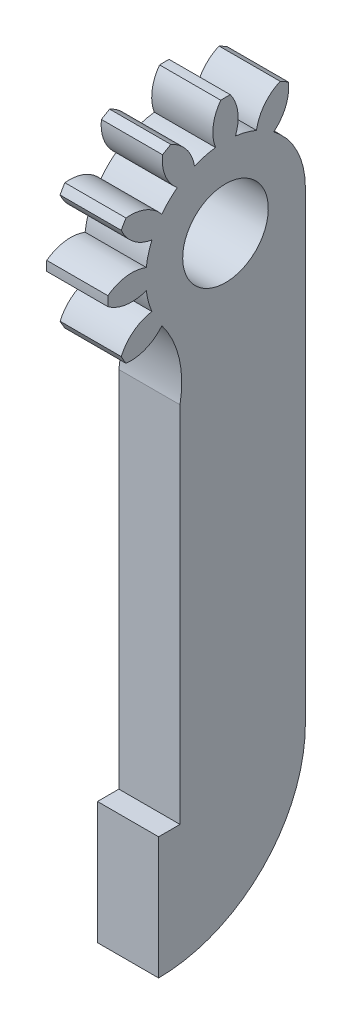
ISO-10303-21;
HEADER;
FILE_DESCRIPTION(('STEP AP214'),'2;1');
FILE_NAME('part.step','',(''),(''),'','','');
FILE_SCHEMA(('AUTOMOTIVE_DESIGN { 1 0 10303 214 1 1 1 1 }'));
ENDSEC;
DATA;
#1=APPLICATION_CONTEXT('core data for automotive mechanical design processes');
#2=APPLICATION_PROTOCOL_DEFINITION('international standard','automotive_design',2000,#1);
#3=PRODUCT_CONTEXT('',#1,'mechanical');
#4=PRODUCT('Part','Part','',(#3));
#5=PRODUCT_RELATED_PRODUCT_CATEGORY('part','',(#4));
#6=PRODUCT_DEFINITION_FORMATION('','',#4);
#7=PRODUCT_DEFINITION_CONTEXT('part definition',#1,'design');
#8=PRODUCT_DEFINITION('design','',#6,#7);
#9=PRODUCT_DEFINITION_SHAPE('','',#8);
#10=(LENGTH_UNIT() NAMED_UNIT(*) SI_UNIT(.MILLI.,.METRE.));
#11=(NAMED_UNIT(*) PLANE_ANGLE_UNIT() SI_UNIT($,.RADIAN.));
#12=(NAMED_UNIT(*) SI_UNIT($,.STERADIAN.) SOLID_ANGLE_UNIT());
#13=UNCERTAINTY_MEASURE_WITH_UNIT(LENGTH_MEASURE(1.E-05),#10,'distance_accuracy_value','');
#14=(GEOMETRIC_REPRESENTATION_CONTEXT(3) GLOBAL_UNCERTAINTY_ASSIGNED_CONTEXT((#13)) GLOBAL_UNIT_ASSIGNED_CONTEXT((#10,
#11,#12)) REPRESENTATION_CONTEXT('',''));
#15=CARTESIAN_POINT('',(0.,0.,0.));
#16=DIRECTION('',(0.,0.,1.));
#17=DIRECTION('',(1.,0.,0.));
#18=AXIS2_PLACEMENT_3D('',#15,#16,#17);
#19=CARTESIAN_POINT('',(5.,0.,0.));
#20=DIRECTION('',(-1.,0.,0.));
#21=DIRECTION('',(0.,-0.258819045102521,0.965925826289068));
#22=AXIS2_PLACEMENT_3D('',#19,#20,#21);
#23=PLANE('',#22);
#24=CARTESIAN_POINT('',(5.,0.,0.));
#25=DIRECTION('',(-1.,0.,0.));
#26=DIRECTION('',(0.,-0.258819045102521,0.965925826289068));
#27=AXIS2_PLACEMENT_3D('',#24,#25,#26);
#28=CIRCLE('',#27,3.5);
#29=CARTESIAN_POINT('',(5.,-0.905866657858825,3.38074039201174));
#30=VERTEX_POINT('',#29);
#31=EDGE_CURVE('E279',#30,#30,#28,.F.);
#32=ORIENTED_EDGE('',*,*,#31,.F.);
#33=EDGE_LOOP('',(#32));
#34=FACE_BOUND('',#33,.T.);
#35=CARTESIAN_POINT('',(5.,-1.86722961459193,7.76589373379012));
#36=DIRECTION('',(-1.,0.,0.));
#37=DIRECTION('',(0.,0.707106781186544,0.707106781186551));
#38=AXIS2_PLACEMENT_3D('',#35,#36,#37);
#39=CIRCLE('',#38,3.3);
#40=CARTESIAN_POINT('',(5.,-3.94616087558726,5.20307403430745));
#41=VERTEX_POINT('',#40);
#42=CARTESIAN_POINT('',(5.,-5.14670283362109,8.1333925850408));
#43=VERTEX_POINT('',#42);
#44=EDGE_CURVE('E323',#41,#43,#39,.T.);
#45=ORIENTED_EDGE('',*,*,#44,.F.);
#46=CARTESIAN_POINT('',(5.,-8.78047610160434,11.5771932907616));
#47=DIRECTION('',(-1.,0.,0.));
#48=DIRECTION('',(0.,0.,1.));
#49=AXIS2_PLACEMENT_3D('',#46,#47,#48);
#50=CIRCLE('',#49,8.);
#51=CARTESIAN_POINT('',(5.,-10.2840002724994,3.71975));
#52=VERTEX_POINT('',#51);
#53=EDGE_CURVE('E256',#41,#52,#50,.T.);
#54=ORIENTED_EDGE('',*,*,#53,.T.);
#55=DIRECTION('',(0.,-1.,0.));
#56=VECTOR('',#55,1.);
#57=CARTESIAN_POINT('',(5.,-40.,3.71975));
#58=LINE('',#57,#56);
#59=CARTESIAN_POINT('',(5.,-40.,3.71975));
#60=VERTEX_POINT('',#59);
#61=EDGE_CURVE('E765',#52,#60,#58,.T.);
#62=ORIENTED_EDGE('',*,*,#61,.T.);
#63=DIRECTION('',(0.,0.,1.));
#64=VECTOR('',#63,1.);
#65=CARTESIAN_POINT('',(5.,-40.,5.46975));
#66=LINE('',#65,#64);
#67=CARTESIAN_POINT('',(5.,-40.,5.46975));
#68=VERTEX_POINT('',#67);
#69=EDGE_CURVE('E754',#60,#68,#66,.T.);
#70=ORIENTED_EDGE('',*,*,#69,.T.);
#71=DIRECTION('',(0.,-1.,0.));
#72=VECTOR('',#71,1.);
#73=CARTESIAN_POINT('',(5.,-50.,5.46975));
#74=LINE('',#73,#72);
#75=CARTESIAN_POINT('',(5.,-50.,5.46975));
#76=VERTEX_POINT('',#75);
#77=EDGE_CURVE('E751',#68,#76,#74,.T.);
#78=ORIENTED_EDGE('',*,*,#77,.T.);
#79=CARTESIAN_POINT('',(5.,-38.,5.46975));
#80=DIRECTION('',(-1.,0.,0.));
#81=DIRECTION('',(0.,0.,1.));
#82=AXIS2_PLACEMENT_3D('',#79,#80,#81);
#83=CIRCLE('',#82,12.);
#84=CARTESIAN_POINT('',(5.,-38.,-6.53024999999999));
#85=VERTEX_POINT('',#84);
#86=EDGE_CURVE('E271',#76,#85,#83,.F.);
#87=ORIENTED_EDGE('',*,*,#86,.T.);
#88=DIRECTION('',(0.,1.,0.));
#89=VECTOR('',#88,1.);
#90=CARTESIAN_POINT('',(5.,0.,-6.53025));
#91=LINE('',#90,#89);
#92=CARTESIAN_POINT('',(5.,0.,-6.53025));
#93=VERTEX_POINT('',#92);
#94=EDGE_CURVE('E237',#85,#93,#91,.T.);
#95=ORIENTED_EDGE('',*,*,#94,.T.);
#96=CARTESIAN_POINT('',(5.,0.,0.));
#97=DIRECTION('',(-1.,0.,0.));
#98=DIRECTION('',(0.,-0.258819045102528,0.965925826289066));
#99=AXIS2_PLACEMENT_3D('',#96,#97,#98);
#100=CIRCLE('',#99,6.53025);
#101=CARTESIAN_POINT('',(5.,5.20307403430752,-3.94616087558717));
#102=VERTEX_POINT('',#101);
#103=EDGE_CURVE('E51',#102,#93,#100,.T.);
#104=ORIENTED_EDGE('',*,*,#103,.F.);
#105=CARTESIAN_POINT('',(5.,7.76589373379015,-1.8672296145918));
#106=DIRECTION('',(-1.,0.,0.));
#107=DIRECTION('',(0.,-0.707106781186539,-0.707106781186556));
#108=AXIS2_PLACEMENT_3D('',#105,#106,#107);
#109=CIRCLE('',#108,3.3);
#110=CARTESIAN_POINT('',(5.,8.13339258504089,-5.14670283362094));
#111=VERTEX_POINT('',#110);
#112=EDGE_CURVE('E345',#111,#102,#109,.T.);
#113=ORIENTED_EDGE('',*,*,#112,.F.);
#114=CARTESIAN_POINT('',(5.,0.,0.));
#115=DIRECTION('',(-1.,0.,0.));
#116=DIRECTION('',(0.,-0.258819045102521,0.965925826289068));
#117=AXIS2_PLACEMENT_3D('',#114,#115,#116);
#118=CIRCLE('',#117,9.625);
#119=CARTESIAN_POINT('',(5.,8.52387169216566,-4.47037318078671));
#120=VERTEX_POINT('',#119);
#121=EDGE_CURVE('E420',#120,#111,#118,.T.);
#122=ORIENTED_EDGE('',*,*,#121,.F.);
#123=CARTESIAN_POINT('',(5.,5.50001514783035,-5.79184644925662));
#124=DIRECTION('',(-1.,0.,0.));
#125=DIRECTION('',(0.,-0.258819045102508,-0.965925826289072));
#126=AXIS2_PLACEMENT_3D('',#123,#124,#125);
#127=CIRCLE('',#126,3.3);
#128=CARTESIAN_POINT('',(5.,6.01901258283256,-2.53291385368776));
#129=VERTEX_POINT('',#128);
#130=EDGE_CURVE('E329',#129,#120,#127,.T.);
#131=ORIENTED_EDGE('',*,*,#130,.F.);
#132=CARTESIAN_POINT('',(5.,0.,0.));
#133=DIRECTION('',(-1.,0.,0.));
#134=DIRECTION('',(0.,-0.258819045102508,-0.965925826289072));
#135=AXIS2_PLACEMENT_3D('',#132,#133,#134);
#136=CIRCLE('',#135,6.53025);
#137=CARTESIAN_POINT('',(5.,6.47907472927509,-0.81593854852496));
#138=VERTEX_POINT('',#137);
#139=EDGE_CURVE('E334',#138,#129,#136,.T.);
#140=ORIENTED_EDGE('',*,*,#139,.F.);
#141=CARTESIAN_POINT('',(5.,7.65907606384855,2.26587858595996));
#142=DIRECTION('',(-1.,0.,0.));
#143=DIRECTION('',(0.,-0.258819045102508,-0.965925826289072));
#144=AXIS2_PLACEMENT_3D('',#141,#142,#143);
#145=CIRCLE('',#144,3.3);
#146=CARTESIAN_POINT('',(5.,9.61707601440787,-0.390479107124634));
#147=VERTEX_POINT('',#146);
#148=EDGE_CURVE('E331',#147,#138,#145,.T.);
#149=ORIENTED_EDGE('',*,*,#148,.F.);
#150=CARTESIAN_POINT('',(5.,9.61707601440786,0.39047910712477));
#151=VERTEX_POINT('',#150);
#152=EDGE_CURVE('E416',#151,#147,#118,.T.);
#153=ORIENTED_EDGE('',*,*,#152,.F.);
#154=CARTESIAN_POINT('',(5.,7.65907606384858,-2.26587858595985));
#155=DIRECTION('',(-1.,0.,0.));
#156=DIRECTION('',(0.,0.258819045102521,-0.965925826289068));
#157=AXIS2_PLACEMENT_3D('',#154,#155,#156);
#158=CIRCLE('',#157,3.3);
#159=CARTESIAN_POINT('',(5.,6.47907472927507,0.815938548525052));
#160=VERTEX_POINT('',#159);
#161=EDGE_CURVE('E388',#160,#151,#158,.T.);
#162=ORIENTED_EDGE('',*,*,#161,.F.);
#163=CARTESIAN_POINT('',(5.,0.,0.));
#164=DIRECTION('',(-1.,0.,0.));
#165=DIRECTION('',(0.,0.258819045102521,-0.965925826289068));
#166=AXIS2_PLACEMENT_3D('',#163,#164,#165);
#167=CIRCLE('',#166,6.53025);
#168=CARTESIAN_POINT('',(5.,6.01901258283252,2.53291385368785));
#169=VERTEX_POINT('',#168);
#170=EDGE_CURVE('E393',#169,#160,#167,.T.);
#171=ORIENTED_EDGE('',*,*,#170,.F.);
#172=CARTESIAN_POINT('',(5.,5.50001514783026,5.79184644925669));
#173=DIRECTION('',(-1.,0.,0.));
#174=DIRECTION('',(0.,0.258819045102521,-0.965925826289068));
#175=AXIS2_PLACEMENT_3D('',#172,#173,#174);
#176=CIRCLE('',#175,3.3);
#177=CARTESIAN_POINT('',(5.,8.52387169216559,4.47037318078683));
#178=VERTEX_POINT('',#177);
#179=EDGE_CURVE('E390',#178,#169,#176,.T.);
#180=ORIENTED_EDGE('',*,*,#179,.F.);
#181=CARTESIAN_POINT('',(5.,8.13339258504082,5.14670283362106));
#182=VERTEX_POINT('',#181);
#183=EDGE_CURVE('E413',#182,#178,#118,.T.);
#184=ORIENTED_EDGE('',*,*,#183,.F.);
#185=CARTESIAN_POINT('',(5.,7.76589373379012,1.86722961459191));
#186=DIRECTION('',(-1.,0.,0.));
#187=DIRECTION('',(0.,0.707106781186549,-0.707106781186546));
#188=AXIS2_PLACEMENT_3D('',#185,#186,#187);
#189=CIRCLE('',#188,3.3);
#190=CARTESIAN_POINT('',(5.,5.20307403430747,3.94616087558724));
#191=VERTEX_POINT('',#190);
#192=EDGE_CURVE('E366',#191,#182,#189,.T.);
#193=ORIENTED_EDGE('',*,*,#192,.F.);
#194=CARTESIAN_POINT('',(5.,0.,0.));
#195=DIRECTION('',(-1.,0.,0.));
#196=DIRECTION('',(0.,0.707106781186549,-0.707106781186546));
#197=AXIS2_PLACEMENT_3D('',#194,#195,#196);
#198=CIRCLE('',#197,6.53025);
#199=CARTESIAN_POINT('',(5.,3.94616087558722,5.20307403430748));
#200=VERTEX_POINT('',#199);
#201=EDGE_CURVE('E371',#200,#191,#198,.T.);
#202=ORIENTED_EDGE('',*,*,#201,.F.);
#203=CARTESIAN_POINT('',(5.,1.86722961459188,7.76589373379013));
#204=DIRECTION('',(-1.,0.,0.));
#205=DIRECTION('',(0.,0.707106781186549,-0.707106781186546));
#206=AXIS2_PLACEMENT_3D('',#203,#204,#205);
#207=CIRCLE('',#206,3.3);
#208=CARTESIAN_POINT('',(5.,5.14670283362103,8.13339258504084));
#209=VERTEX_POINT('',#208);
#210=EDGE_CURVE('E368',#209,#200,#207,.T.);
#211=ORIENTED_EDGE('',*,*,#210,.F.);
#212=CARTESIAN_POINT('',(5.,4.4703731807868,8.52387169216561));
#213=VERTEX_POINT('',#212);
#214=EDGE_CURVE('E421',#213,#209,#118,.T.);
#215=ORIENTED_EDGE('',*,*,#214,.F.);
#216=CARTESIAN_POINT('',(5.,5.79184644925667,5.50001514783029));
#217=DIRECTION('',(-1.,0.,0.));
#218=DIRECTION('',(0.,0.965925826289069,-0.258819045102518));
#219=AXIS2_PLACEMENT_3D('',#216,#217,#218);
#220=CIRCLE('',#219,3.3);
#221=CARTESIAN_POINT('',(5.,2.53291385368783,6.01901258283253));
#222=VERTEX_POINT('',#221);
#223=EDGE_CURVE('E283',#222,#213,#220,.T.);
#224=ORIENTED_EDGE('',*,*,#223,.F.);
#225=CARTESIAN_POINT('',(5.,0.,0.));
#226=DIRECTION('',(-1.,0.,0.));
#227=DIRECTION('',(0.,0.965925826289069,-0.258819045102518));
#228=AXIS2_PLACEMENT_3D('',#225,#226,#227);
#229=CIRCLE('',#228,6.53025);
#230=CARTESIAN_POINT('',(5.,0.815938548525029,6.47907472927508));
#231=VERTEX_POINT('',#230);
#232=EDGE_CURVE('E288',#231,#222,#229,.T.);
#233=ORIENTED_EDGE('',*,*,#232,.F.);
#234=CARTESIAN_POINT('',(5.,-2.26587858595988,7.65907606384858));
#235=DIRECTION('',(-1.,0.,0.));
#236=DIRECTION('',(0.,0.965925826289069,-0.258819045102518));
#237=AXIS2_PLACEMENT_3D('',#234,#235,#236);
#238=CIRCLE('',#237,3.3);
#239=CARTESIAN_POINT('',(5.,0.390479107124735,9.61707601440787));
#240=VERTEX_POINT('',#239);
#241=EDGE_CURVE('E285',#240,#231,#238,.T.);
#242=ORIENTED_EDGE('',*,*,#241,.F.);
#243=CARTESIAN_POINT('',(5.,-0.390479107124802,9.61707601440786));
#244=VERTEX_POINT('',#243);
#245=EDGE_CURVE('E468',#244,#240,#118,.T.);
#246=ORIENTED_EDGE('',*,*,#245,.F.);
#247=CARTESIAN_POINT('',(5.,2.26587858595983,7.65907606384859));
#248=DIRECTION('',(-1.,0.,0.));
#249=DIRECTION('',(0.,0.965925826289067,0.258819045102525));
#250=AXIS2_PLACEMENT_3D('',#247,#248,#249);
#251=CIRCLE('',#250,3.3);
#252=CARTESIAN_POINT('',(5.,-0.815938548525075,6.47907472927507));
#253=VERTEX_POINT('',#252);
#254=EDGE_CURVE('E302',#253,#244,#251,.T.);
#255=ORIENTED_EDGE('',*,*,#254,.F.);
#256=CARTESIAN_POINT('',(5.,0.,0.));
#257=DIRECTION('',(-1.,0.,0.));
#258=DIRECTION('',(0.,0.965925826289067,0.258819045102525));
#259=AXIS2_PLACEMENT_3D('',#256,#257,#258);
#260=CIRCLE('',#259,6.53025);
#261=CARTESIAN_POINT('',(5.,-2.53291385368787,6.01901258283251));
#262=VERTEX_POINT('',#261);
#263=EDGE_CURVE('E307',#262,#253,#260,.T.);
#264=ORIENTED_EDGE('',*,*,#263,.F.);
#265=CARTESIAN_POINT('',(5.,-5.79184644925671,5.50001514783024));
#266=DIRECTION('',(-1.,0.,0.));
#267=DIRECTION('',(0.,0.965925826289067,0.258819045102525));
#268=AXIS2_PLACEMENT_3D('',#265,#266,#267);
#269=CIRCLE('',#268,3.3);
#270=CARTESIAN_POINT('',(5.,-4.47037318078686,8.52387169216557));
#271=VERTEX_POINT('',#270);
#272=EDGE_CURVE('E304',#271,#262,#269,.T.);
#273=ORIENTED_EDGE('',*,*,#272,.F.);
#274=EDGE_CURVE('E446',#43,#271,#118,.T.);
#275=ORIENTED_EDGE('',*,*,#274,.F.);
#276=EDGE_LOOP('',(#45,#54,#62,#70,#78,#87,#95,#104,#113,#122,#131,#140,#149,#153,#162,#171,
#180,#184,#193,#202,#211,#215,#224,#233,#242,#246,#255,#264,#273,#275));
#277=FACE_BOUND('',#276,.T.);
#278=ADVANCED_FACE('F36',(#34,#277),#23,.F.);
#279=CARTESIAN_POINT('',(-10.,0.,0.));
#280=DIRECTION('',(-1.,0.,0.));
#281=DIRECTION('',(0.,-0.258819045102521,0.965925826289068));
#282=AXIS2_PLACEMENT_3D('',#279,#280,#281);
#283=CYLINDRICAL_SURFACE('',#282,9.625);
#284=DIRECTION('',(-1.,0.,0.));
#285=VECTOR('',#284,1.);
#286=CARTESIAN_POINT('',(2.5,4.4703731807868,8.52387169216561));
#287=LINE('',#286,#285);
#288=CARTESIAN_POINT('',(0.,4.4703731807868,8.52387169216561));
#289=VERTEX_POINT('',#288);
#290=EDGE_CURVE('E363',#213,#289,#287,.T.);
#291=ORIENTED_EDGE('',*,*,#290,.F.);
#292=ORIENTED_EDGE('',*,*,#214,.T.);
#293=DIRECTION('',(-1.,0.,0.));
#294=VECTOR('',#293,1.);
#295=CARTESIAN_POINT('',(2.5,5.14670283362103,8.13339258504084));
#296=LINE('',#295,#294);
#297=CARTESIAN_POINT('',(0.,5.14670283362103,8.13339258504084));
#298=VERTEX_POINT('',#297);
#299=EDGE_CURVE('E382',#298,#209,#296,.F.);
#300=ORIENTED_EDGE('',*,*,#299,.F.);
#301=CARTESIAN_POINT('',(0.,0.,0.));
#302=DIRECTION('',(-1.,0.,0.));
#303=DIRECTION('',(0.,-0.258819045102521,0.965925826289068));
#304=AXIS2_PLACEMENT_3D('',#301,#302,#303);
#305=CIRCLE('',#304,9.625);
#306=EDGE_CURVE('E415',#289,#298,#305,.T.);
#307=ORIENTED_EDGE('',*,*,#306,.F.);
#308=EDGE_LOOP('',(#291,#292,#300,#307));
#309=FACE_BOUND('',#308,.T.);
#310=ADVANCED_FACE('F496',(#309),#283,.T.);
#311=DIRECTION('',(-1.,0.,0.));
#312=VECTOR('',#311,1.);
#313=CARTESIAN_POINT('',(2.5,0.390479107124735,9.61707601440787));
#314=LINE('',#313,#312);
#315=CARTESIAN_POINT('',(0.,0.390479107124735,9.61707601440787));
#316=VERTEX_POINT('',#315);
#317=EDGE_CURVE('E361',#316,#240,#314,.F.);
#318=ORIENTED_EDGE('',*,*,#317,.F.);
#319=CARTESIAN_POINT('',(0.,-0.390479107124802,9.61707601440787));
#320=VERTEX_POINT('',#319);
#321=EDGE_CURVE('E447',#320,#316,#305,.T.);
#322=ORIENTED_EDGE('',*,*,#321,.F.);
#323=DIRECTION('',(-1.,0.,0.));
#324=VECTOR('',#323,1.);
#325=CARTESIAN_POINT('',(2.5,-0.390479107124802,9.61707601440787));
#326=LINE('',#325,#324);
#327=EDGE_CURVE('E359',#244,#320,#326,.T.);
#328=ORIENTED_EDGE('',*,*,#327,.F.);
#329=ORIENTED_EDGE('',*,*,#245,.T.);
#330=EDGE_LOOP('',(#318,#322,#328,#329));
#331=FACE_BOUND('',#330,.T.);
#332=ADVANCED_FACE('F479',(#331),#283,.T.);
#333=DIRECTION('',(-1.,0.,0.));
#334=VECTOR('',#333,1.);
#335=CARTESIAN_POINT('',(2.5,-4.47037318078686,8.52387169216558));
#336=LINE('',#335,#334);
#337=CARTESIAN_POINT('',(0.,-4.47037318078686,8.52387169216558));
#338=VERTEX_POINT('',#337);
#339=EDGE_CURVE('E357',#338,#271,#336,.F.);
#340=ORIENTED_EDGE('',*,*,#339,.F.);
#341=CARTESIAN_POINT('',(0.,-5.14670283362109,8.1333925850408));
#342=VERTEX_POINT('',#341);
#343=EDGE_CURVE('E444',#342,#338,#305,.T.);
#344=ORIENTED_EDGE('',*,*,#343,.F.);
#345=DIRECTION('',(-1.,0.,0.));
#346=VECTOR('',#345,1.);
#347=CARTESIAN_POINT('',(2.5,-5.14670283362109,8.1333925850408));
#348=LINE('',#347,#346);
#349=EDGE_CURVE('E355',#43,#342,#348,.T.);
#350=ORIENTED_EDGE('',*,*,#349,.F.);
#351=ORIENTED_EDGE('',*,*,#274,.T.);
#352=EDGE_LOOP('',(#340,#344,#350,#351));
#353=FACE_BOUND('',#352,.T.);
#354=ADVANCED_FACE('F442',(#353),#283,.T.);
#355=DIRECTION('',(-1.,0.,0.));
#356=VECTOR('',#355,1.);
#357=CARTESIAN_POINT('',(2.5,8.52387169216566,-4.47037318078671));
#358=LINE('',#357,#356);
#359=CARTESIAN_POINT('',(0.,8.52387169216566,-4.47037318078671));
#360=VERTEX_POINT('',#359);
#361=EDGE_CURVE('E353',#120,#360,#358,.T.);
#362=ORIENTED_EDGE('',*,*,#361,.F.);
#363=ORIENTED_EDGE('',*,*,#121,.T.);
#364=DIRECTION('',(-1.,0.,0.));
#365=VECTOR('',#364,1.);
#366=CARTESIAN_POINT('',(2.5,8.1333925850409,-5.14670283362094));
#367=LINE('',#366,#365);
#368=CARTESIAN_POINT('',(0.,8.1333925850409,-5.14670283362094));
#369=VERTEX_POINT('',#368);
#370=EDGE_CURVE('E301',#369,#111,#367,.F.);
#371=ORIENTED_EDGE('',*,*,#370,.F.);
#372=EDGE_CURVE('E414',#360,#369,#305,.T.);
#373=ORIENTED_EDGE('',*,*,#372,.F.);
#374=EDGE_LOOP('',(#362,#363,#371,#373));
#375=FACE_BOUND('',#374,.T.);
#376=ADVANCED_FACE('F770',(#375),#283,.T.);
#377=DIRECTION('',(-1.,0.,0.));
#378=VECTOR('',#377,1.);
#379=CARTESIAN_POINT('',(2.5,9.61707601440787,-0.390479107124634));
#380=LINE('',#379,#378);
#381=CARTESIAN_POINT('',(0.,9.61707601440787,-0.390479107124634));
#382=VERTEX_POINT('',#381);
#383=EDGE_CURVE('E351',#382,#147,#380,.F.);
#384=ORIENTED_EDGE('',*,*,#383,.F.);
#385=CARTESIAN_POINT('',(0.,9.61707601440787,0.390479107124769));
#386=VERTEX_POINT('',#385);
#387=EDGE_CURVE('E410',#386,#382,#305,.T.);
#388=ORIENTED_EDGE('',*,*,#387,.F.);
#389=DIRECTION('',(-1.,0.,0.));
#390=VECTOR('',#389,1.);
#391=CARTESIAN_POINT('',(2.5,9.61707601440787,0.390479107124769));
#392=LINE('',#391,#390);
#393=EDGE_CURVE('E407',#151,#386,#392,.T.);
#394=ORIENTED_EDGE('',*,*,#393,.F.);
#395=ORIENTED_EDGE('',*,*,#152,.T.);
#396=EDGE_LOOP('',(#384,#388,#394,#395));
#397=FACE_BOUND('',#396,.T.);
#398=ADVANCED_FACE('F693',(#397),#283,.T.);
#399=CARTESIAN_POINT('',(0.,0.,0.));
#400=DIRECTION('',(1.,0.,0.));
#401=DIRECTION('',(0.,0.258819045102521,-0.965925826289068));
#402=AXIS2_PLACEMENT_3D('',#399,#400,#401);
#403=PLANE('',#402);
#404=CARTESIAN_POINT('',(0.,0.,0.));
#405=DIRECTION('',(1.,0.,0.));
#406=DIRECTION('',(0.,0.258819045102521,-0.965925826289068));
#407=AXIS2_PLACEMENT_3D('',#404,#405,#406);
#408=CIRCLE('',#407,3.5);
#409=CARTESIAN_POINT('',(0.,0.905866657858825,-3.38074039201174));
#410=VERTEX_POINT('',#409);
#411=EDGE_CURVE('E39',#410,#410,#408,.F.);
#412=ORIENTED_EDGE('',*,*,#411,.F.);
#413=EDGE_LOOP('',(#412));
#414=FACE_BOUND('',#413,.T.);
#415=CARTESIAN_POINT('',(0.,7.76589373379015,-1.8672296145918));
#416=DIRECTION('',(1.,0.,0.));
#417=DIRECTION('',(0.,0.258819045102521,-0.965925826289068));
#418=AXIS2_PLACEMENT_3D('',#415,#416,#417);
#419=CIRCLE('',#418,3.3);
#420=CARTESIAN_POINT('',(0.,5.20307403430752,-3.94616087558717));
#421=VERTEX_POINT('',#420);
#422=EDGE_CURVE('E427',#421,#369,#419,.T.);
#423=ORIENTED_EDGE('',*,*,#422,.F.);
#424=CARTESIAN_POINT('',(0.,0.,0.));
#425=DIRECTION('',(-1.,0.,0.));
#426=DIRECTION('',(0.,-0.258819045102528,0.965925826289066));
#427=AXIS2_PLACEMENT_3D('',#424,#425,#426);
#428=CIRCLE('',#427,6.53025);
#429=CARTESIAN_POINT('',(0.,0.,-6.53025));
#430=VERTEX_POINT('',#429);
#431=EDGE_CURVE('E253',#421,#430,#428,.T.);
#432=ORIENTED_EDGE('',*,*,#431,.T.);
#433=DIRECTION('',(0.,-1.,0.));
#434=VECTOR('',#433,1.);
#435=CARTESIAN_POINT('',(0.,0.,-6.53025));
#436=LINE('',#435,#434);
#437=CARTESIAN_POINT('',(0.,-38.,-6.53024999999999));
#438=VERTEX_POINT('',#437);
#439=EDGE_CURVE('E236',#430,#438,#436,.T.);
#440=ORIENTED_EDGE('',*,*,#439,.T.);
#441=CARTESIAN_POINT('',(0.,-38.,5.46975));
#442=DIRECTION('',(-1.,0.,0.));
#443=DIRECTION('',(0.,0.,1.));
#444=AXIS2_PLACEMENT_3D('',#441,#442,#443);
#445=CIRCLE('',#444,12.);
#446=CARTESIAN_POINT('',(0.,-50.,5.46975));
#447=VERTEX_POINT('',#446);
#448=EDGE_CURVE('E243',#438,#447,#445,.T.);
#449=ORIENTED_EDGE('',*,*,#448,.T.);
#450=DIRECTION('',(0.,1.,0.));
#451=VECTOR('',#450,1.);
#452=CARTESIAN_POINT('',(0.,-50.,5.46975));
#453=LINE('',#452,#451);
#454=CARTESIAN_POINT('',(0.,-40.,5.46975));
#455=VERTEX_POINT('',#454);
#456=EDGE_CURVE('E249',#447,#455,#453,.T.);
#457=ORIENTED_EDGE('',*,*,#456,.T.);
#458=DIRECTION('',(0.,0.,-1.));
#459=VECTOR('',#458,1.);
#460=CARTESIAN_POINT('',(0.,-40.,5.46975));
#461=LINE('',#460,#459);
#462=CARTESIAN_POINT('',(0.,-40.,3.71975));
#463=VERTEX_POINT('',#462);
#464=EDGE_CURVE('E260',#455,#463,#461,.T.);
#465=ORIENTED_EDGE('',*,*,#464,.T.);
#466=DIRECTION('',(0.,1.,0.));
#467=VECTOR('',#466,1.);
#468=CARTESIAN_POINT('',(0.,-40.,3.71975));
#469=LINE('',#468,#467);
#470=CARTESIAN_POINT('',(0.,-10.2840002724994,3.71975));
#471=VERTEX_POINT('',#470);
#472=EDGE_CURVE('E263',#463,#471,#469,.T.);
#473=ORIENTED_EDGE('',*,*,#472,.T.);
#474=CARTESIAN_POINT('',(0.,-8.78047610160434,11.5771932907616));
#475=DIRECTION('',(1.,0.,0.));
#476=DIRECTION('',(0.,0.,1.));
#477=AXIS2_PLACEMENT_3D('',#474,#475,#476);
#478=CIRCLE('',#477,8.);
#479=CARTESIAN_POINT('',(0.,-3.94616087558726,5.20307403430745));
#480=VERTEX_POINT('',#479);
#481=EDGE_CURVE('E266',#471,#480,#478,.T.);
#482=ORIENTED_EDGE('',*,*,#481,.T.);
#483=CARTESIAN_POINT('',(0.,-1.86722961459193,7.76589373379012));
#484=DIRECTION('',(-1.,0.,0.));
#485=DIRECTION('',(0.,0.707106781186544,0.707106781186551));
#486=AXIS2_PLACEMENT_3D('',#483,#484,#485);
#487=CIRCLE('',#486,3.3);
#488=EDGE_CURVE('E320',#480,#342,#487,.T.);
#489=ORIENTED_EDGE('',*,*,#488,.T.);
#490=ORIENTED_EDGE('',*,*,#343,.T.);
#491=CARTESIAN_POINT('',(0.,-5.79184644925671,5.50001514783024));
#492=DIRECTION('',(1.,0.,0.));
#493=DIRECTION('',(0.,0.258819045102521,-0.965925826289068));
#494=AXIS2_PLACEMENT_3D('',#491,#492,#493);
#495=CIRCLE('',#494,3.3);
#496=CARTESIAN_POINT('',(0.,-2.53291385368787,6.01901258283251));
#497=VERTEX_POINT('',#496);
#498=EDGE_CURVE('E44',#497,#338,#495,.T.);
#499=ORIENTED_EDGE('',*,*,#498,.F.);
#500=CARTESIAN_POINT('',(0.,0.,0.));
#501=DIRECTION('',(-1.,0.,0.));
#502=DIRECTION('',(0.,0.965925826289067,0.258819045102525));
#503=AXIS2_PLACEMENT_3D('',#500,#501,#502);
#504=CIRCLE('',#503,6.53025);
#505=CARTESIAN_POINT('',(0.,-0.815938548525075,6.47907472927507));
#506=VERTEX_POINT('',#505);
#507=EDGE_CURVE('E305',#497,#506,#504,.T.);
#508=ORIENTED_EDGE('',*,*,#507,.T.);
#509=CARTESIAN_POINT('',(0.,2.26587858595983,7.65907606384859));
#510=DIRECTION('',(-1.,0.,0.));
#511=DIRECTION('',(0.,0.965925826289067,0.258819045102525));
#512=AXIS2_PLACEMENT_3D('',#509,#510,#511);
#513=CIRCLE('',#512,3.3);
#514=EDGE_CURVE('E310',#506,#320,#513,.T.);
#515=ORIENTED_EDGE('',*,*,#514,.T.);
#516=ORIENTED_EDGE('',*,*,#321,.T.);
#517=CARTESIAN_POINT('',(0.,-2.26587858595988,7.65907606384858));
#518=DIRECTION('',(1.,0.,0.));
#519=DIRECTION('',(0.,0.258819045102521,-0.965925826289068));
#520=AXIS2_PLACEMENT_3D('',#517,#518,#519);
#521=CIRCLE('',#520,3.3);
#522=CARTESIAN_POINT('',(0.,0.815938548525029,6.47907472927508));
#523=VERTEX_POINT('',#522);
#524=EDGE_CURVE('E11',#523,#316,#521,.T.);
#525=ORIENTED_EDGE('',*,*,#524,.F.);
#526=CARTESIAN_POINT('',(0.,0.,0.));
#527=DIRECTION('',(-1.,0.,0.));
#528=DIRECTION('',(0.,0.965925826289069,-0.258819045102518));
#529=AXIS2_PLACEMENT_3D('',#526,#527,#528);
#530=CIRCLE('',#529,6.53025);
#531=CARTESIAN_POINT('',(0.,2.53291385368783,6.01901258283253));
#532=VERTEX_POINT('',#531);
#533=EDGE_CURVE('E286',#523,#532,#530,.T.);
#534=ORIENTED_EDGE('',*,*,#533,.T.);
#535=CARTESIAN_POINT('',(0.,5.79184644925667,5.50001514783029));
#536=DIRECTION('',(-1.,0.,0.));
#537=DIRECTION('',(0.,0.965925826289069,-0.258819045102518));
#538=AXIS2_PLACEMENT_3D('',#535,#536,#537);
#539=CIRCLE('',#538,3.3);
#540=EDGE_CURVE('E291',#532,#289,#539,.T.);
#541=ORIENTED_EDGE('',*,*,#540,.T.);
#542=ORIENTED_EDGE('',*,*,#306,.T.);
#543=CARTESIAN_POINT('',(0.,1.86722961459188,7.76589373379013));
#544=DIRECTION('',(1.,0.,0.));
#545=DIRECTION('',(0.,0.258819045102521,-0.965925826289068));
#546=AXIS2_PLACEMENT_3D('',#543,#544,#545);
#547=CIRCLE('',#546,3.3);
#548=CARTESIAN_POINT('',(0.,3.94616087558722,5.20307403430748));
#549=VERTEX_POINT('',#548);
#550=EDGE_CURVE('E424',#549,#298,#547,.T.);
#551=ORIENTED_EDGE('',*,*,#550,.F.);
#552=CARTESIAN_POINT('',(0.,0.,0.));
#553=DIRECTION('',(-1.,0.,0.));
#554=DIRECTION('',(0.,0.707106781186549,-0.707106781186546));
#555=AXIS2_PLACEMENT_3D('',#552,#553,#554);
#556=CIRCLE('',#555,6.53025);
#557=CARTESIAN_POINT('',(0.,5.20307403430747,3.94616087558724));
#558=VERTEX_POINT('',#557);
#559=EDGE_CURVE('E369',#549,#558,#556,.T.);
#560=ORIENTED_EDGE('',*,*,#559,.T.);
#561=CARTESIAN_POINT('',(0.,7.76589373379012,1.86722961459191));
#562=DIRECTION('',(-1.,0.,0.));
#563=DIRECTION('',(0.,0.707106781186549,-0.707106781186546));
#564=AXIS2_PLACEMENT_3D('',#561,#562,#563);
#565=CIRCLE('',#564,3.3);
#566=CARTESIAN_POINT('',(0.,8.13339258504082,5.14670283362106));
#567=VERTEX_POINT('',#566);
#568=EDGE_CURVE('E365',#558,#567,#565,.T.);
#569=ORIENTED_EDGE('',*,*,#568,.T.);
#570=CARTESIAN_POINT('',(0.,8.52387169216559,4.47037318078683));
#571=VERTEX_POINT('',#570);
#572=EDGE_CURVE('E409',#567,#571,#305,.T.);
#573=ORIENTED_EDGE('',*,*,#572,.T.);
#574=CARTESIAN_POINT('',(0.,5.50001514783026,5.79184644925669));
#575=DIRECTION('',(1.,0.,0.));
#576=DIRECTION('',(0.,0.258819045102521,-0.965925826289068));
#577=AXIS2_PLACEMENT_3D('',#574,#575,#576);
#578=CIRCLE('',#577,3.3);
#579=CARTESIAN_POINT('',(0.,6.01901258283252,2.53291385368785));
#580=VERTEX_POINT('',#579);
#581=EDGE_CURVE('E419',#580,#571,#578,.T.);
#582=ORIENTED_EDGE('',*,*,#581,.F.);
#583=CARTESIAN_POINT('',(0.,0.,0.));
#584=DIRECTION('',(-1.,0.,0.));
#585=DIRECTION('',(0.,0.258819045102521,-0.965925826289068));
#586=AXIS2_PLACEMENT_3D('',#583,#584,#585);
#587=CIRCLE('',#586,6.53025);
#588=CARTESIAN_POINT('',(0.,6.47907472927507,0.815938548525052));
#589=VERTEX_POINT('',#588);
#590=EDGE_CURVE('E391',#580,#589,#587,.T.);
#591=ORIENTED_EDGE('',*,*,#590,.T.);
#592=CARTESIAN_POINT('',(0.,7.65907606384858,-2.26587858595985));
#593=DIRECTION('',(-1.,0.,0.));
#594=DIRECTION('',(0.,0.258819045102521,-0.965925826289068));
#595=AXIS2_PLACEMENT_3D('',#592,#593,#594);
#596=CIRCLE('',#595,3.3);
#597=EDGE_CURVE('E387',#589,#386,#596,.T.);
#598=ORIENTED_EDGE('',*,*,#597,.T.);
#599=ORIENTED_EDGE('',*,*,#387,.T.);
#600=CARTESIAN_POINT('',(0.,7.65907606384855,2.26587858595996));
#601=DIRECTION('',(1.,0.,0.));
#602=DIRECTION('',(0.,0.258819045102521,-0.965925826289068));
#603=AXIS2_PLACEMENT_3D('',#600,#601,#602);
#604=CIRCLE('',#603,3.3);
#605=CARTESIAN_POINT('',(0.,6.47907472927509,-0.81593854852496));
#606=VERTEX_POINT('',#605);
#607=EDGE_CURVE('E429',#606,#382,#604,.T.);
#608=ORIENTED_EDGE('',*,*,#607,.F.);
#609=CARTESIAN_POINT('',(0.,0.,0.));
#610=DIRECTION('',(-1.,0.,0.));
#611=DIRECTION('',(0.,-0.258819045102508,-0.965925826289072));
#612=AXIS2_PLACEMENT_3D('',#609,#610,#611);
#613=CIRCLE('',#612,6.53025);
#614=CARTESIAN_POINT('',(0.,6.01901258283256,-2.53291385368776));
#615=VERTEX_POINT('',#614);
#616=EDGE_CURVE('E332',#606,#615,#613,.T.);
#617=ORIENTED_EDGE('',*,*,#616,.T.);
#618=CARTESIAN_POINT('',(0.,5.50001514783035,-5.79184644925662));
#619=DIRECTION('',(-1.,0.,0.));
#620=DIRECTION('',(0.,-0.258819045102508,-0.965925826289072));
#621=AXIS2_PLACEMENT_3D('',#618,#619,#620);
#622=CIRCLE('',#621,3.3);
#623=EDGE_CURVE('E282',#615,#360,#622,.T.);
#624=ORIENTED_EDGE('',*,*,#623,.T.);
#625=ORIENTED_EDGE('',*,*,#372,.T.);
#626=EDGE_LOOP('',(#423,#432,#440,#449,#457,#465,#473,#482,#489,#490,#499,#508,#515,#516,#525,
#534,#541,#542,#551,#560,#569,#573,#582,#591,#598,#599,#608,#617,#624,#625));
#627=FACE_BOUND('',#626,.T.);
#628=ADVANCED_FACE('F252',(#414,#627),#403,.F.);
#629=DIRECTION('',(-1.,0.,0.));
#630=VECTOR('',#629,1.);
#631=CARTESIAN_POINT('',(2.5,8.13339258504082,5.14670283362106));
#632=LINE('',#631,#630);
#633=EDGE_CURVE('E385',#182,#567,#632,.T.);
#634=ORIENTED_EDGE('',*,*,#633,.F.);
#635=ORIENTED_EDGE('',*,*,#183,.T.);
#636=DIRECTION('',(-1.,0.,0.));
#637=VECTOR('',#636,1.);
#638=CARTESIAN_POINT('',(2.5,8.52387169216559,4.47037318078683));
#639=LINE('',#638,#637);
#640=EDGE_CURVE('E404',#571,#178,#639,.F.);
#641=ORIENTED_EDGE('',*,*,#640,.F.);
#642=ORIENTED_EDGE('',*,*,#572,.F.);
#643=EDGE_LOOP('',(#634,#635,#641,#642));
#644=FACE_BOUND('',#643,.T.);
#645=ADVANCED_FACE('F464',(#644),#283,.T.);
#646=CARTESIAN_POINT('',(5.,7.65907606384858,-2.26587858595985));
#647=DIRECTION('',(-1.,0.,0.));
#648=DIRECTION('',(0.,-0.258819045102521,0.965925826289068));
#649=AXIS2_PLACEMENT_3D('',#646,#647,#648);
#650=CYLINDRICAL_SURFACE('',#649,3.3);
#651=ORIENTED_EDGE('',*,*,#393,.T.);
#652=ORIENTED_EDGE('',*,*,#597,.F.);
#653=DIRECTION('',(-1.,0.,0.));
#654=VECTOR('',#653,1.);
#655=CARTESIAN_POINT('',(5.,6.47907472927507,0.815938548525052));
#656=LINE('',#655,#654);
#657=EDGE_CURVE('E395',#160,#589,#656,.T.);
#658=ORIENTED_EDGE('',*,*,#657,.F.);
#659=ORIENTED_EDGE('',*,*,#161,.T.);
#660=EDGE_LOOP('',(#651,#652,#658,#659));
#661=FACE_BOUND('',#660,.T.);
#662=ADVANCED_FACE('F785',(#661),#650,.T.);
#663=CARTESIAN_POINT('',(5.,5.50001514783026,5.79184644925669));
#664=DIRECTION('',(-1.,0.,0.));
#665=DIRECTION('',(0.,-0.258819045102521,0.965925826289068));
#666=AXIS2_PLACEMENT_3D('',#663,#664,#665);
#667=CYLINDRICAL_SURFACE('',#666,3.3);
#668=ORIENTED_EDGE('',*,*,#640,.T.);
#669=ORIENTED_EDGE('',*,*,#179,.T.);
#670=DIRECTION('',(-1.,0.,0.));
#671=VECTOR('',#670,1.);
#672=CARTESIAN_POINT('',(5.,6.01901258283252,2.53291385368785));
#673=LINE('',#672,#671);
#674=EDGE_CURVE('E402',#169,#580,#673,.T.);
#675=ORIENTED_EDGE('',*,*,#674,.T.);
#676=ORIENTED_EDGE('',*,*,#581,.T.);
#677=EDGE_LOOP('',(#668,#669,#675,#676));
#678=FACE_BOUND('',#677,.T.);
#679=ADVANCED_FACE('F460',(#678),#667,.T.);
#680=CARTESIAN_POINT('',(5.,0.,0.));
#681=DIRECTION('',(-1.,0.,0.));
#682=DIRECTION('',(0.,-0.258819045102521,0.965925826289068));
#683=AXIS2_PLACEMENT_3D('',#680,#681,#682);
#684=CYLINDRICAL_SURFACE('',#683,6.53025);
#685=ORIENTED_EDGE('',*,*,#590,.F.);
#686=ORIENTED_EDGE('',*,*,#674,.F.);
#687=ORIENTED_EDGE('',*,*,#170,.T.);
#688=ORIENTED_EDGE('',*,*,#657,.T.);
#689=EDGE_LOOP('',(#685,#686,#687,#688));
#690=FACE_BOUND('',#689,.T.);
#691=ADVANCED_FACE('F510',(#690),#684,.T.);
#692=CARTESIAN_POINT('',(5.,7.76589373379012,1.86722961459191));
#693=DIRECTION('',(-1.,0.,0.));
#694=DIRECTION('',(0.,-0.258819045102521,0.965925826289068));
#695=AXIS2_PLACEMENT_3D('',#692,#693,#694);
#696=CYLINDRICAL_SURFACE('',#695,3.3);
#697=ORIENTED_EDGE('',*,*,#633,.T.);
#698=ORIENTED_EDGE('',*,*,#568,.F.);
#699=DIRECTION('',(-1.,0.,0.));
#700=VECTOR('',#699,1.);
#701=CARTESIAN_POINT('',(5.,5.20307403430747,3.94616087558724));
#702=LINE('',#701,#700);
#703=EDGE_CURVE('E373',#191,#558,#702,.T.);
#704=ORIENTED_EDGE('',*,*,#703,.F.);
#705=ORIENTED_EDGE('',*,*,#192,.T.);
#706=EDGE_LOOP('',(#697,#698,#704,#705));
#707=FACE_BOUND('',#706,.T.);
#708=ADVANCED_FACE('F508',(#707),#696,.T.);
#709=CARTESIAN_POINT('',(5.,1.86722961459188,7.76589373379013));
#710=DIRECTION('',(-1.,0.,0.));
#711=DIRECTION('',(0.,-0.258819045102521,0.965925826289068));
#712=AXIS2_PLACEMENT_3D('',#709,#710,#711);
#713=CYLINDRICAL_SURFACE('',#712,3.3);
#714=ORIENTED_EDGE('',*,*,#299,.T.);
#715=ORIENTED_EDGE('',*,*,#210,.T.);
#716=DIRECTION('',(-1.,0.,0.));
#717=VECTOR('',#716,1.);
#718=CARTESIAN_POINT('',(5.,3.94616087558722,5.20307403430748));
#719=LINE('',#718,#717);
#720=EDGE_CURVE('E380',#200,#549,#719,.T.);
#721=ORIENTED_EDGE('',*,*,#720,.T.);
#722=ORIENTED_EDGE('',*,*,#550,.T.);
#723=EDGE_LOOP('',(#714,#715,#721,#722));
#724=FACE_BOUND('',#723,.T.);
#725=ADVANCED_FACE('F500',(#724),#713,.T.);
#726=CARTESIAN_POINT('',(5.,0.,0.));
#727=DIRECTION('',(-1.,0.,0.));
#728=DIRECTION('',(0.,-0.258819045102521,0.965925826289068));
#729=AXIS2_PLACEMENT_3D('',#726,#727,#728);
#730=CYLINDRICAL_SURFACE('',#729,6.53025);
#731=ORIENTED_EDGE('',*,*,#559,.F.);
#732=ORIENTED_EDGE('',*,*,#720,.F.);
#733=ORIENTED_EDGE('',*,*,#201,.T.);
#734=ORIENTED_EDGE('',*,*,#703,.T.);
#735=EDGE_LOOP('',(#731,#732,#733,#734));
#736=FACE_BOUND('',#735,.T.);
#737=ADVANCED_FACE('F506',(#736),#730,.T.);
#738=CARTESIAN_POINT('',(5.,7.76589373379015,-1.8672296145918));
#739=DIRECTION('',(-1.,0.,0.));
#740=DIRECTION('',(0.,-0.258819045102521,0.965925826289068));
#741=AXIS2_PLACEMENT_3D('',#738,#739,#740);
#742=CYLINDRICAL_SURFACE('',#741,3.3);
#743=ORIENTED_EDGE('',*,*,#370,.T.);
#744=ORIENTED_EDGE('',*,*,#112,.T.);
#745=DIRECTION('',(-1.,0.,0.));
#746=VECTOR('',#745,1.);
#747=CARTESIAN_POINT('',(5.,5.20307403430752,-3.94616087558717));
#748=LINE('',#747,#746);
#749=EDGE_CURVE('E322',#102,#421,#748,.T.);
#750=ORIENTED_EDGE('',*,*,#749,.T.);
#751=ORIENTED_EDGE('',*,*,#422,.T.);
#752=EDGE_LOOP('',(#743,#744,#750,#751));
#753=FACE_BOUND('',#752,.T.);
#754=ADVANCED_FACE('F578',(#753),#742,.T.);
#755=CARTESIAN_POINT('',(5.,5.50001514783035,-5.79184644925662));
#756=DIRECTION('',(-1.,0.,0.));
#757=DIRECTION('',(0.,-0.258819045102521,0.965925826289068));
#758=AXIS2_PLACEMENT_3D('',#755,#756,#757);
#759=CYLINDRICAL_SURFACE('',#758,3.3);
#760=ORIENTED_EDGE('',*,*,#361,.T.);
#761=ORIENTED_EDGE('',*,*,#623,.F.);
#762=DIRECTION('',(-1.,0.,0.));
#763=VECTOR('',#762,1.);
#764=CARTESIAN_POINT('',(5.,6.01901258283256,-2.53291385368776));
#765=LINE('',#764,#763);
#766=EDGE_CURVE('E336',#129,#615,#765,.T.);
#767=ORIENTED_EDGE('',*,*,#766,.F.);
#768=ORIENTED_EDGE('',*,*,#130,.T.);
#769=EDGE_LOOP('',(#760,#761,#767,#768));
#770=FACE_BOUND('',#769,.T.);
#771=ADVANCED_FACE('F574',(#770),#759,.T.);
#772=CARTESIAN_POINT('',(5.,7.65907606384855,2.26587858595996));
#773=DIRECTION('',(-1.,0.,0.));
#774=DIRECTION('',(0.,-0.258819045102521,0.965925826289068));
#775=AXIS2_PLACEMENT_3D('',#772,#773,#774);
#776=CYLINDRICAL_SURFACE('',#775,3.3);
#777=ORIENTED_EDGE('',*,*,#383,.T.);
#778=ORIENTED_EDGE('',*,*,#148,.T.);
#779=DIRECTION('',(-1.,0.,0.));
#780=VECTOR('',#779,1.);
#781=CARTESIAN_POINT('',(5.,6.47907472927509,-0.81593854852496));
#782=LINE('',#781,#780);
#783=EDGE_CURVE('E343',#138,#606,#782,.T.);
#784=ORIENTED_EDGE('',*,*,#783,.T.);
#785=ORIENTED_EDGE('',*,*,#607,.T.);
#786=EDGE_LOOP('',(#777,#778,#784,#785));
#787=FACE_BOUND('',#786,.T.);
#788=ADVANCED_FACE('F570',(#787),#776,.T.);
#789=CARTESIAN_POINT('',(5.,0.,0.));
#790=DIRECTION('',(-1.,0.,0.));
#791=DIRECTION('',(0.,-0.258819045102521,0.965925826289068));
#792=AXIS2_PLACEMENT_3D('',#789,#790,#791);
#793=CYLINDRICAL_SURFACE('',#792,6.53025);
#794=ORIENTED_EDGE('',*,*,#616,.F.);
#795=ORIENTED_EDGE('',*,*,#783,.F.);
#796=ORIENTED_EDGE('',*,*,#139,.T.);
#797=ORIENTED_EDGE('',*,*,#766,.T.);
#798=EDGE_LOOP('',(#794,#795,#796,#797));
#799=FACE_BOUND('',#798,.T.);
#800=ADVANCED_FACE('F566',(#799),#793,.T.);
#801=CARTESIAN_POINT('',(5.,-1.86722961459193,7.76589373379012));
#802=DIRECTION('',(-1.,0.,0.));
#803=DIRECTION('',(0.,-0.258819045102521,0.965925826289068));
#804=AXIS2_PLACEMENT_3D('',#801,#802,#803);
#805=CYLINDRICAL_SURFACE('',#804,3.3);
#806=ORIENTED_EDGE('',*,*,#349,.T.);
#807=ORIENTED_EDGE('',*,*,#488,.F.);
#808=DIRECTION('',(-1.,0.,0.));
#809=VECTOR('',#808,1.);
#810=CARTESIAN_POINT('',(5.,-3.94616087558726,5.20307403430745));
#811=LINE('',#810,#809);
#812=EDGE_CURVE('E313',#41,#480,#811,.T.);
#813=ORIENTED_EDGE('',*,*,#812,.F.);
#814=ORIENTED_EDGE('',*,*,#44,.T.);
#815=EDGE_LOOP('',(#806,#807,#813,#814));
#816=FACE_BOUND('',#815,.T.);
#817=ADVANCED_FACE('F563',(#816),#805,.T.);
#818=CARTESIAN_POINT('',(5.,0.,0.));
#819=DIRECTION('',(-1.,0.,0.));
#820=DIRECTION('',(0.,-0.258819045102521,0.965925826289068));
#821=AXIS2_PLACEMENT_3D('',#818,#819,#820);
#822=CYLINDRICAL_SURFACE('',#821,6.53025);
#823=DIRECTION('',(-1.,0.,0.));
#824=VECTOR('',#823,1.);
#825=CARTESIAN_POINT('',(56.4198405287297,0.,-6.53025));
#826=LINE('',#825,#824);
#827=EDGE_CURVE('E56',#93,#430,#826,.T.);
#828=ORIENTED_EDGE('',*,*,#827,.T.);
#829=ORIENTED_EDGE('',*,*,#431,.F.);
#830=ORIENTED_EDGE('',*,*,#749,.F.);
#831=ORIENTED_EDGE('',*,*,#103,.T.);
#832=EDGE_LOOP('',(#828,#829,#830,#831));
#833=FACE_BOUND('',#832,.T.);
#834=ADVANCED_FACE('F559',(#833),#822,.T.);
#835=CARTESIAN_POINT('',(5.,2.26587858595983,7.65907606384859));
#836=DIRECTION('',(-1.,0.,0.));
#837=DIRECTION('',(0.,-0.258819045102521,0.965925826289068));
#838=AXIS2_PLACEMENT_3D('',#835,#836,#837);
#839=CYLINDRICAL_SURFACE('',#838,3.3);
#840=ORIENTED_EDGE('',*,*,#327,.T.);
#841=ORIENTED_EDGE('',*,*,#514,.F.);
#842=DIRECTION('',(-1.,0.,0.));
#843=VECTOR('',#842,1.);
#844=CARTESIAN_POINT('',(5.,-0.815938548525075,6.47907472927507));
#845=LINE('',#844,#843);
#846=EDGE_CURVE('E309',#253,#506,#845,.T.);
#847=ORIENTED_EDGE('',*,*,#846,.F.);
#848=ORIENTED_EDGE('',*,*,#254,.T.);
#849=EDGE_LOOP('',(#840,#841,#847,#848));
#850=FACE_BOUND('',#849,.T.);
#851=ADVANCED_FACE('F556',(#850),#839,.T.);
#852=CARTESIAN_POINT('',(5.,-5.79184644925671,5.50001514783024));
#853=DIRECTION('',(-1.,0.,0.));
#854=DIRECTION('',(0.,-0.258819045102521,0.965925826289068));
#855=AXIS2_PLACEMENT_3D('',#852,#853,#854);
#856=CYLINDRICAL_SURFACE('',#855,3.3);
#857=ORIENTED_EDGE('',*,*,#339,.T.);
#858=ORIENTED_EDGE('',*,*,#272,.T.);
#859=DIRECTION('',(-1.,0.,0.));
#860=VECTOR('',#859,1.);
#861=CARTESIAN_POINT('',(5.,-2.53291385368787,6.01901258283251));
#862=LINE('',#861,#860);
#863=EDGE_CURVE('E294',#262,#497,#862,.T.);
#864=ORIENTED_EDGE('',*,*,#863,.T.);
#865=ORIENTED_EDGE('',*,*,#498,.T.);
#866=EDGE_LOOP('',(#857,#858,#864,#865));
#867=FACE_BOUND('',#866,.T.);
#868=ADVANCED_FACE('F434',(#867),#856,.T.);
#869=CARTESIAN_POINT('',(5.,0.,0.));
#870=DIRECTION('',(-1.,0.,0.));
#871=DIRECTION('',(0.,-0.258819045102521,0.965925826289068));
#872=AXIS2_PLACEMENT_3D('',#869,#870,#871);
#873=CYLINDRICAL_SURFACE('',#872,6.53025);
#874=ORIENTED_EDGE('',*,*,#507,.F.);
#875=ORIENTED_EDGE('',*,*,#863,.F.);
#876=ORIENTED_EDGE('',*,*,#263,.T.);
#877=ORIENTED_EDGE('',*,*,#846,.T.);
#878=EDGE_LOOP('',(#874,#875,#876,#877));
#879=FACE_BOUND('',#878,.T.);
#880=ADVANCED_FACE('F550',(#879),#873,.T.);
#881=CARTESIAN_POINT('',(5.,5.79184644925667,5.50001514783029));
#882=DIRECTION('',(-1.,0.,0.));
#883=DIRECTION('',(0.,-0.258819045102521,0.965925826289068));
#884=AXIS2_PLACEMENT_3D('',#881,#882,#883);
#885=CYLINDRICAL_SURFACE('',#884,3.3);
#886=ORIENTED_EDGE('',*,*,#290,.T.);
#887=ORIENTED_EDGE('',*,*,#540,.F.);
#888=DIRECTION('',(-1.,0.,0.));
#889=VECTOR('',#888,1.);
#890=CARTESIAN_POINT('',(5.,2.53291385368783,6.01901258283253));
#891=LINE('',#890,#889);
#892=EDGE_CURVE('E290',#222,#532,#891,.T.);
#893=ORIENTED_EDGE('',*,*,#892,.F.);
#894=ORIENTED_EDGE('',*,*,#223,.T.);
#895=EDGE_LOOP('',(#886,#887,#893,#894));
#896=FACE_BOUND('',#895,.T.);
#897=ADVANCED_FACE('F547',(#896),#885,.T.);
#898=CARTESIAN_POINT('',(5.,-2.26587858595988,7.65907606384858));
#899=DIRECTION('',(-1.,0.,0.));
#900=DIRECTION('',(0.,-0.258819045102521,0.965925826289068));
#901=AXIS2_PLACEMENT_3D('',#898,#899,#900);
#902=CYLINDRICAL_SURFACE('',#901,3.3);
#903=ORIENTED_EDGE('',*,*,#317,.T.);
#904=ORIENTED_EDGE('',*,*,#241,.T.);
#905=DIRECTION('',(-1.,0.,0.));
#906=VECTOR('',#905,1.);
#907=CARTESIAN_POINT('',(5.,0.815938548525029,6.47907472927508));
#908=LINE('',#907,#906);
#909=EDGE_CURVE('E299',#231,#523,#908,.T.);
#910=ORIENTED_EDGE('',*,*,#909,.T.);
#911=ORIENTED_EDGE('',*,*,#524,.T.);
#912=EDGE_LOOP('',(#903,#904,#910,#911));
#913=FACE_BOUND('',#912,.T.);
#914=ADVANCED_FACE('F487',(#913),#902,.T.);
#915=CARTESIAN_POINT('',(5.,0.,0.));
#916=DIRECTION('',(-1.,0.,0.));
#917=DIRECTION('',(0.,-0.258819045102521,0.965925826289068));
#918=AXIS2_PLACEMENT_3D('',#915,#916,#917);
#919=CYLINDRICAL_SURFACE('',#918,6.53025);
#920=ORIENTED_EDGE('',*,*,#533,.F.);
#921=ORIENTED_EDGE('',*,*,#909,.F.);
#922=ORIENTED_EDGE('',*,*,#232,.T.);
#923=ORIENTED_EDGE('',*,*,#892,.T.);
#924=EDGE_LOOP('',(#920,#921,#922,#923));
#925=FACE_BOUND('',#924,.T.);
#926=ADVANCED_FACE('F490',(#925),#919,.T.);
#927=CARTESIAN_POINT('',(50.0000508,0.,0.));
#928=DIRECTION('',(-1.,0.,0.));
#929=DIRECTION('',(0.,-0.258819045102521,0.965925826289068));
#930=AXIS2_PLACEMENT_3D('',#927,#928,#929);
#931=CYLINDRICAL_SURFACE('',#930,3.5);
#932=ORIENTED_EDGE('',*,*,#411,.T.);
#933=EDGE_LOOP('',(#932));
#934=FACE_BOUND('',#933,.T.);
#935=ORIENTED_EDGE('',*,*,#31,.T.);
#936=EDGE_LOOP('',(#935));
#937=FACE_BOUND('',#936,.T.);
#938=ADVANCED_FACE('F528',(#934,#937),#931,.F.);
#939=CARTESIAN_POINT('',(56.4198405287297,-8.78047610160434,11.5771932907616));
#940=DIRECTION('',(-1.,0.,0.));
#941=DIRECTION('',(0.,0.,1.));
#942=AXIS2_PLACEMENT_3D('',#939,#940,#941);
#943=CYLINDRICAL_SURFACE('',#942,8.);
#944=ORIENTED_EDGE('',*,*,#53,.F.);
#945=ORIENTED_EDGE('',*,*,#812,.T.);
#946=ORIENTED_EDGE('',*,*,#481,.F.);
#947=DIRECTION('',(-1.,0.,0.));
#948=VECTOR('',#947,1.);
#949=CARTESIAN_POINT('',(56.4198405287297,-10.2840002724994,3.71975));
#950=LINE('',#949,#948);
#951=EDGE_CURVE('E269',#52,#471,#950,.T.);
#952=ORIENTED_EDGE('',*,*,#951,.F.);
#953=EDGE_LOOP('',(#944,#945,#946,#952));
#954=FACE_BOUND('',#953,.T.);
#955=ADVANCED_FACE('F530',(#954),#943,.F.);
#956=CARTESIAN_POINT('',(56.4198405287297,-40.,3.71975));
#957=DIRECTION('',(0.,0.,1.));
#958=DIRECTION('',(1.,0.,0.));
#959=AXIS2_PLACEMENT_3D('',#956,#957,#958);
#960=PLANE('',#959);
#961=ORIENTED_EDGE('',*,*,#61,.F.);
#962=ORIENTED_EDGE('',*,*,#951,.T.);
#963=ORIENTED_EDGE('',*,*,#472,.F.);
#964=DIRECTION('',(-1.,0.,0.));
#965=VECTOR('',#964,1.);
#966=CARTESIAN_POINT('',(56.4198405287297,-40.,3.71975));
#967=LINE('',#966,#965);
#968=EDGE_CURVE('E272',#60,#463,#967,.T.);
#969=ORIENTED_EDGE('',*,*,#968,.F.);
#970=EDGE_LOOP('',(#961,#962,#963,#969));
#971=FACE_BOUND('',#970,.T.);
#972=ADVANCED_FACE('F537',(#971),#960,.T.);
#973=CARTESIAN_POINT('',(56.4198405287297,-40.,5.46975));
#974=DIRECTION('',(0.,1.,0.));
#975=DIRECTION('',(0.,0.,1.));
#976=AXIS2_PLACEMENT_3D('',#973,#974,#975);
#977=PLANE('',#976);
#978=ORIENTED_EDGE('',*,*,#69,.F.);
#979=ORIENTED_EDGE('',*,*,#968,.T.);
#980=ORIENTED_EDGE('',*,*,#464,.F.);
#981=DIRECTION('',(-1.,0.,0.));
#982=VECTOR('',#981,1.);
#983=CARTESIAN_POINT('',(56.4198405287297,-40.,5.46975));
#984=LINE('',#983,#982);
#985=EDGE_CURVE('E274',#68,#455,#984,.T.);
#986=ORIENTED_EDGE('',*,*,#985,.F.);
#987=EDGE_LOOP('',(#978,#979,#980,#986));
#988=FACE_BOUND('',#987,.T.);
#989=ADVANCED_FACE('F710',(#988),#977,.T.);
#990=CARTESIAN_POINT('',(56.4198405287297,-50.,5.46975));
#991=DIRECTION('',(0.,0.,1.));
#992=DIRECTION('',(0.,-1.,0.));
#993=AXIS2_PLACEMENT_3D('',#990,#991,#992);
#994=PLANE('',#993);
#995=ORIENTED_EDGE('',*,*,#77,.F.);
#996=ORIENTED_EDGE('',*,*,#985,.T.);
#997=ORIENTED_EDGE('',*,*,#456,.F.);
#998=DIRECTION('',(-1.,0.,0.));
#999=VECTOR('',#998,1.);
#1000=CARTESIAN_POINT('',(56.4198405287297,-50.,5.46975));
#1001=LINE('',#1000,#999);
#1002=EDGE_CURVE('E240',#76,#447,#1001,.T.);
#1003=ORIENTED_EDGE('',*,*,#1002,.F.);
#1004=EDGE_LOOP('',(#995,#996,#997,#1003));
#1005=FACE_BOUND('',#1004,.T.);
#1006=ADVANCED_FACE('F719',(#1005),#994,.T.);
#1007=CARTESIAN_POINT('',(56.4198405287297,-38.,5.46975));
#1008=DIRECTION('',(-1.,0.,0.));
#1009=DIRECTION('',(0.,0.,1.));
#1010=AXIS2_PLACEMENT_3D('',#1007,#1008,#1009);
#1011=CYLINDRICAL_SURFACE('',#1010,12.);
#1012=ORIENTED_EDGE('',*,*,#86,.F.);
#1013=ORIENTED_EDGE('',*,*,#1002,.T.);
#1014=ORIENTED_EDGE('',*,*,#448,.F.);
#1015=DIRECTION('',(-1.,0.,0.));
#1016=VECTOR('',#1015,1.);
#1017=CARTESIAN_POINT('',(56.4198405287297,-38.,-6.53024999999999));
#1018=LINE('',#1017,#1016);
#1019=EDGE_CURVE('E232',#85,#438,#1018,.T.);
#1020=ORIENTED_EDGE('',*,*,#1019,.F.);
#1021=EDGE_LOOP('',(#1012,#1013,#1014,#1020));
#1022=FACE_BOUND('',#1021,.T.);
#1023=ADVANCED_FACE('F244',(#1022),#1011,.T.);
#1024=CARTESIAN_POINT('',(56.4198405287297,0.,-6.53025));
#1025=DIRECTION('',(0.,0.,-1.));
#1026=DIRECTION('',(0.,1.,0.));
#1027=AXIS2_PLACEMENT_3D('',#1024,#1025,#1026);
#1028=PLANE('',#1027);
#1029=ORIENTED_EDGE('',*,*,#94,.F.);
#1030=ORIENTED_EDGE('',*,*,#1019,.T.);
#1031=ORIENTED_EDGE('',*,*,#439,.F.);
#1032=ORIENTED_EDGE('',*,*,#827,.F.);
#1033=EDGE_LOOP('',(#1029,#1030,#1031,#1032));
#1034=FACE_BOUND('',#1033,.T.);
#1035=ADVANCED_FACE('F234',(#1034),#1028,.T.);
#1036=CLOSED_SHELL('',(#278,#310,#332,#354,#376,#398,#628,#645,#662,#679,#691,#708,#725,#737,
#754,#771,#788,#800,#817,#834,#851,#868,#880,#897,#914,#926,#938,#955,#972,#989,#1006,#1023,#1035));
#1037=MANIFOLD_SOLID_BREP('B2',#1036);
#1038=ADVANCED_BREP_SHAPE_REPRESENTATION('',(#18,#1037),#14);
#1039=SHAPE_DEFINITION_REPRESENTATION(#9,#1038);
ENDSEC;
END-ISO-10303-21;
